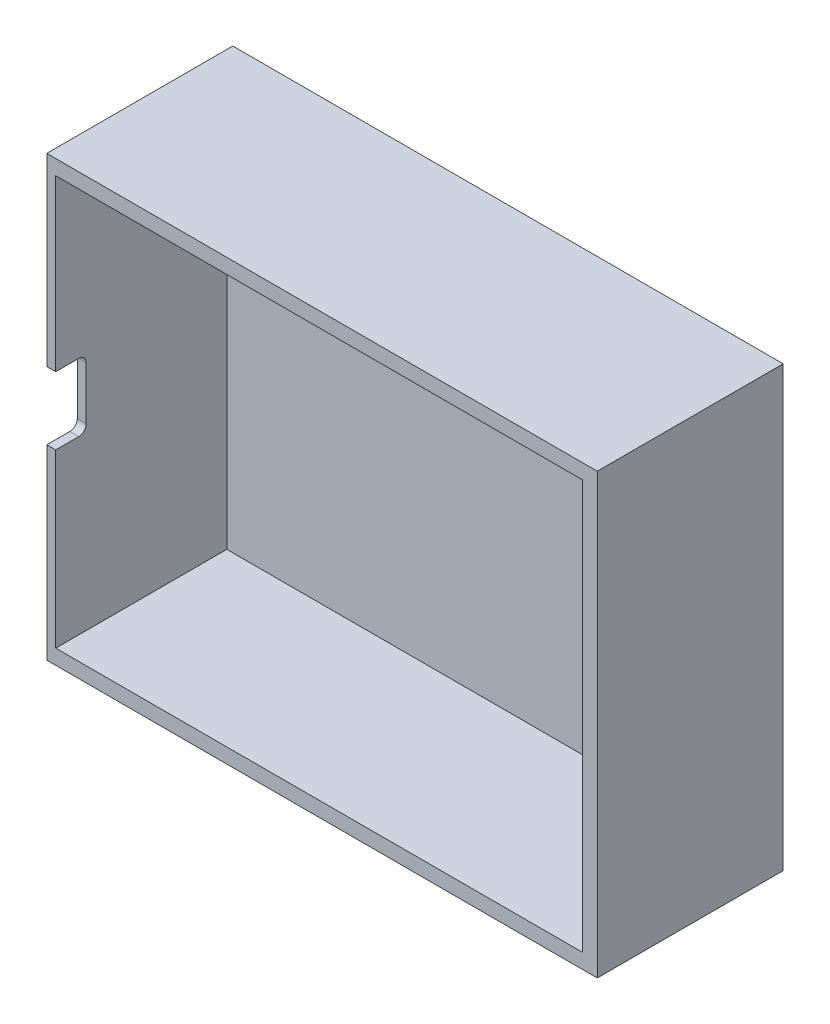
ISO-10303-21;
HEADER;
FILE_DESCRIPTION(('STEP AP214'),'2;1');
FILE_NAME('part.step','',(''),(''),'','','');
FILE_SCHEMA(('AUTOMOTIVE_DESIGN { 1 0 10303 214 1 1 1 1 }'));
ENDSEC;
DATA;
#1=APPLICATION_CONTEXT('core data for automotive mechanical design processes');
#2=APPLICATION_PROTOCOL_DEFINITION('international standard','automotive_design',2000,#1);
#3=PRODUCT_CONTEXT('',#1,'mechanical');
#4=PRODUCT('Part','Part','',(#3));
#5=PRODUCT_RELATED_PRODUCT_CATEGORY('part','',(#4));
#6=PRODUCT_DEFINITION_FORMATION('','',#4);
#7=PRODUCT_DEFINITION_CONTEXT('part definition',#1,'design');
#8=PRODUCT_DEFINITION('design','',#6,#7);
#9=PRODUCT_DEFINITION_SHAPE('','',#8);
#10=(LENGTH_UNIT() NAMED_UNIT(*) SI_UNIT(.MILLI.,.METRE.));
#11=(NAMED_UNIT(*) PLANE_ANGLE_UNIT() SI_UNIT($,.RADIAN.));
#12=(NAMED_UNIT(*) SI_UNIT($,.STERADIAN.) SOLID_ANGLE_UNIT());
#13=UNCERTAINTY_MEASURE_WITH_UNIT(LENGTH_MEASURE(1.E-05),#10,'distance_accuracy_value','');
#14=(GEOMETRIC_REPRESENTATION_CONTEXT(3) GLOBAL_UNCERTAINTY_ASSIGNED_CONTEXT((#13)) GLOBAL_UNIT_ASSIGNED_CONTEXT((#10,
#11,#12)) REPRESENTATION_CONTEXT('',''));
#15=CARTESIAN_POINT('',(0.,0.,0.));
#16=DIRECTION('',(0.,0.,1.));
#17=DIRECTION('',(1.,0.,0.));
#18=AXIS2_PLACEMENT_3D('',#15,#16,#17);
#19=CARTESIAN_POINT('',(590.712029930621,17.7517985611511,25.));
#20=DIRECTION('',(1.,0.,0.));
#21=DIRECTION('',(0.,0.,-1.));
#22=AXIS2_PLACEMENT_3D('',#19,#20,#21);
#23=PLANE('',#22);
#24=DIRECTION('',(0.,-1.,0.));
#25=VECTOR('',#24,1.);
#26=CARTESIAN_POINT('',(590.712029930621,17.7517985611511,25.));
#27=LINE('',#26,#25);
#28=CARTESIAN_POINT('',(590.712029930621,-16.1723211134984,25.));
#29=VERTEX_POINT('',#28);
#30=CARTESIAN_POINT('',(590.712029930621,-41.2482014388489,25.));
#31=VERTEX_POINT('',#30);
#32=EDGE_CURVE('E175',#29,#31,#27,.T.);
#33=ORIENTED_EDGE('',*,*,#32,.F.);
#34=DIRECTION('',(0.,0.,1.));
#35=VECTOR('',#34,1.);
#36=CARTESIAN_POINT('',(590.712029930621,-16.1723211134984,21.9));
#37=LINE('',#36,#35);
#38=CARTESIAN_POINT('',(590.712029930621,-16.1723211134984,21.9));
#39=VERTEX_POINT('',#38);
#40=EDGE_CURVE('E142',#39,#29,#37,.T.);
#41=ORIENTED_EDGE('',*,*,#40,.F.);
#42=CARTESIAN_POINT('',(590.712029930621,-15.1723211134984,21.9));
#43=DIRECTION('',(-1.,0.,0.));
#44=DIRECTION('',(0.,0.,1.));
#45=AXIS2_PLACEMENT_3D('',#42,#43,#44);
#46=CIRCLE('',#45,1.);
#47=CARTESIAN_POINT('',(590.712029930621,-15.1723211134984,20.9));
#48=VERTEX_POINT('',#47);
#49=EDGE_CURVE('E229',#48,#39,#46,.T.);
#50=ORIENTED_EDGE('',*,*,#49,.F.);
#51=DIRECTION('',(0.,-1.,0.));
#52=VECTOR('',#51,1.);
#53=CARTESIAN_POINT('',(590.712029930621,-8.07232111349837,20.9));
#54=LINE('',#53,#52);
#55=CARTESIAN_POINT('',(590.712029930621,-8.07232111349837,20.9));
#56=VERTEX_POINT('',#55);
#57=EDGE_CURVE('E222',#56,#48,#54,.T.);
#58=ORIENTED_EDGE('',*,*,#57,.F.);
#59=CARTESIAN_POINT('',(590.712029930621,-8.07232111349837,21.9));
#60=DIRECTION('',(-1.,0.,0.));
#61=DIRECTION('',(0.,0.,-1.));
#62=AXIS2_PLACEMENT_3D('',#59,#60,#61);
#63=CIRCLE('',#62,1.);
#64=CARTESIAN_POINT('',(590.712029930621,-7.07232111349837,21.9));
#65=VERTEX_POINT('',#64);
#66=EDGE_CURVE('E220',#65,#56,#63,.T.);
#67=ORIENTED_EDGE('',*,*,#66,.F.);
#68=DIRECTION('',(0.,0.,-1.));
#69=VECTOR('',#68,1.);
#70=CARTESIAN_POINT('',(590.712029930621,-7.07232111349838,21.9));
#71=LINE('',#70,#69);
#72=CARTESIAN_POINT('',(590.712029930621,-7.07232111349837,25.));
#73=VERTEX_POINT('',#72);
#74=EDGE_CURVE('E217',#73,#65,#71,.T.);
#75=ORIENTED_EDGE('',*,*,#74,.F.);
#76=CARTESIAN_POINT('',(590.712029930621,17.7517985611511,25.));
#77=VERTEX_POINT('',#76);
#78=EDGE_CURVE('E152',#77,#73,#27,.T.);
#79=ORIENTED_EDGE('',*,*,#78,.F.);
#80=DIRECTION('',(0.,0.,-1.));
#81=VECTOR('',#80,1.);
#82=CARTESIAN_POINT('',(590.712029930621,17.7517985611511,25.));
#83=LINE('',#82,#81);
#84=CARTESIAN_POINT('',(590.712029930621,17.7517985611511,0.));
#85=VERTEX_POINT('',#84);
#86=EDGE_CURVE('E181',#77,#85,#83,.T.);
#87=ORIENTED_EDGE('',*,*,#86,.T.);
#88=DIRECTION('',(0.,-1.,0.));
#89=VECTOR('',#88,1.);
#90=CARTESIAN_POINT('',(590.712029930621,17.7517985611511,0.));
#91=LINE('',#90,#89);
#92=CARTESIAN_POINT('',(590.712029930621,-41.2482014388489,0.));
#93=VERTEX_POINT('',#92);
#94=EDGE_CURVE('E182',#85,#93,#91,.T.);
#95=ORIENTED_EDGE('',*,*,#94,.T.);
#96=DIRECTION('',(0.,0.,-1.));
#97=VECTOR('',#96,1.);
#98=CARTESIAN_POINT('',(590.712029930621,-41.2482014388489,25.));
#99=LINE('',#98,#97);
#100=EDGE_CURVE('E11',#31,#93,#99,.T.);
#101=ORIENTED_EDGE('',*,*,#100,.F.);
#102=EDGE_LOOP('',(#33,#41,#50,#58,#67,#75,#79,#87,#95,#101));
#103=FACE_BOUND('',#102,.T.);
#104=ADVANCED_FACE('F33',(#103),#23,.F.);
#105=CARTESIAN_POINT('',(590.712029930621,-41.2482014388489,25.));
#106=DIRECTION('',(0.,1.,0.));
#107=DIRECTION('',(0.,0.,1.));
#108=AXIS2_PLACEMENT_3D('',#105,#106,#107);
#109=PLANE('',#108);
#110=DIRECTION('',(1.,0.,0.));
#111=VECTOR('',#110,1.);
#112=CARTESIAN_POINT('',(590.712029930621,-41.2482014388489,0.));
#113=LINE('',#112,#111);
#114=CARTESIAN_POINT('',(664.712029930621,-41.2482014388489,0.));
#115=VERTEX_POINT('',#114);
#116=EDGE_CURVE('E185',#93,#115,#113,.T.);
#117=ORIENTED_EDGE('',*,*,#116,.T.);
#118=DIRECTION('',(0.,0.,-1.));
#119=VECTOR('',#118,1.);
#120=CARTESIAN_POINT('',(664.712029930621,-41.2482014388489,25.));
#121=LINE('',#120,#119);
#122=CARTESIAN_POINT('',(664.712029930621,-41.2482014388489,25.));
#123=VERTEX_POINT('',#122);
#124=EDGE_CURVE('E40',#123,#115,#121,.T.);
#125=ORIENTED_EDGE('',*,*,#124,.F.);
#126=DIRECTION('',(1.,0.,0.));
#127=VECTOR('',#126,1.);
#128=CARTESIAN_POINT('',(590.712029930621,-41.2482014388489,25.));
#129=LINE('',#128,#127);
#130=EDGE_CURVE('E174',#31,#123,#129,.T.);
#131=ORIENTED_EDGE('',*,*,#130,.F.);
#132=ORIENTED_EDGE('',*,*,#100,.T.);
#133=EDGE_LOOP('',(#117,#125,#131,#132));
#134=FACE_BOUND('',#133,.T.);
#135=ADVANCED_FACE('F284',(#134),#109,.F.);
#136=CARTESIAN_POINT('',(664.712029930621,17.7517985611511,25.));
#137=DIRECTION('',(-1.,0.,0.));
#138=DIRECTION('',(0.,-1.,0.));
#139=AXIS2_PLACEMENT_3D('',#136,#137,#138);
#140=PLANE('',#139);
#141=DIRECTION('',(0.,1.,0.));
#142=VECTOR('',#141,1.);
#143=CARTESIAN_POINT('',(664.712029930621,17.7517985611511,0.));
#144=LINE('',#143,#142);
#145=CARTESIAN_POINT('',(664.712029930621,17.7517985611511,0.));
#146=VERTEX_POINT('',#145);
#147=EDGE_CURVE('E188',#115,#146,#144,.T.);
#148=ORIENTED_EDGE('',*,*,#147,.T.);
#149=DIRECTION('',(0.,0.,-1.));
#150=VECTOR('',#149,1.);
#151=CARTESIAN_POINT('',(664.712029930621,17.7517985611511,25.));
#152=LINE('',#151,#150);
#153=CARTESIAN_POINT('',(664.712029930621,17.7517985611511,25.));
#154=VERTEX_POINT('',#153);
#155=EDGE_CURVE('E194',#154,#146,#152,.T.);
#156=ORIENTED_EDGE('',*,*,#155,.F.);
#157=DIRECTION('',(0.,1.,0.));
#158=VECTOR('',#157,1.);
#159=CARTESIAN_POINT('',(664.712029930621,17.7517985611511,25.));
#160=LINE('',#159,#158);
#161=EDGE_CURVE('E177',#123,#154,#160,.T.);
#162=ORIENTED_EDGE('',*,*,#161,.F.);
#163=ORIENTED_EDGE('',*,*,#124,.T.);
#164=EDGE_LOOP('',(#148,#156,#162,#163));
#165=FACE_BOUND('',#164,.T.);
#166=ADVANCED_FACE('F201',(#165),#140,.F.);
#167=CARTESIAN_POINT('',(590.712029930621,17.7517985611511,25.));
#168=DIRECTION('',(0.,-1.,0.));
#169=DIRECTION('',(0.,0.,-1.));
#170=AXIS2_PLACEMENT_3D('',#167,#168,#169);
#171=PLANE('',#170);
#172=DIRECTION('',(-1.,0.,0.));
#173=VECTOR('',#172,1.);
#174=CARTESIAN_POINT('',(590.712029930621,17.7517985611511,0.));
#175=LINE('',#174,#173);
#176=EDGE_CURVE('E190',#146,#85,#175,.T.);
#177=ORIENTED_EDGE('',*,*,#176,.T.);
#178=ORIENTED_EDGE('',*,*,#86,.F.);
#179=DIRECTION('',(-1.,0.,0.));
#180=VECTOR('',#179,1.);
#181=CARTESIAN_POINT('',(590.712029930621,17.7517985611511,25.));
#182=LINE('',#181,#180);
#183=EDGE_CURVE('E179',#154,#77,#182,.T.);
#184=ORIENTED_EDGE('',*,*,#183,.F.);
#185=ORIENTED_EDGE('',*,*,#155,.T.);
#186=EDGE_LOOP('',(#177,#178,#184,#185));
#187=FACE_BOUND('',#186,.T.);
#188=ADVANCED_FACE('F211',(#187),#171,.F.);
#189=CARTESIAN_POINT('',(0.,0.,25.));
#190=DIRECTION('',(0.,0.,1.));
#191=DIRECTION('',(1.,0.,0.));
#192=AXIS2_PLACEMENT_3D('',#189,#190,#191);
#193=PLANE('',#192);
#194=DIRECTION('',(-1.,0.,0.));
#195=VECTOR('',#194,1.);
#196=CARTESIAN_POINT('',(591.912029930621,-16.1723211134984,25.));
#197=LINE('',#196,#195);
#198=CARTESIAN_POINT('',(591.912029930621,-16.1723211134984,25.));
#199=VERTEX_POINT('',#198);
#200=EDGE_CURVE('E233',#199,#29,#197,.T.);
#201=ORIENTED_EDGE('',*,*,#200,.T.);
#202=ORIENTED_EDGE('',*,*,#32,.T.);
#203=ORIENTED_EDGE('',*,*,#130,.T.);
#204=ORIENTED_EDGE('',*,*,#161,.T.);
#205=ORIENTED_EDGE('',*,*,#183,.T.);
#206=ORIENTED_EDGE('',*,*,#78,.T.);
#207=DIRECTION('',(-1.,0.,0.));
#208=VECTOR('',#207,1.);
#209=CARTESIAN_POINT('',(591.912029930621,-7.07232111349837,25.));
#210=LINE('',#209,#208);
#211=CARTESIAN_POINT('',(591.912029930621,-7.07232111349837,25.));
#212=VERTEX_POINT('',#211);
#213=EDGE_CURVE('E137',#212,#73,#210,.T.);
#214=ORIENTED_EDGE('',*,*,#213,.F.);
#215=DIRECTION('',(0.,-1.,0.));
#216=VECTOR('',#215,1.);
#217=CARTESIAN_POINT('',(591.912029930621,17.7517985611511,25.));
#218=LINE('',#217,#216);
#219=CARTESIAN_POINT('',(591.912029930621,15.7517985611511,25.));
#220=VERTEX_POINT('',#219);
#221=EDGE_CURVE('E150',#220,#212,#218,.T.);
#222=ORIENTED_EDGE('',*,*,#221,.F.);
#223=DIRECTION('',(-1.,0.,0.));
#224=VECTOR('',#223,1.);
#225=CARTESIAN_POINT('',(590.712029930621,15.7517985611511,25.));
#226=LINE('',#225,#224);
#227=CARTESIAN_POINT('',(662.712029930621,15.7517985611511,25.));
#228=VERTEX_POINT('',#227);
#229=EDGE_CURVE('E171',#228,#220,#226,.T.);
#230=ORIENTED_EDGE('',*,*,#229,.F.);
#231=DIRECTION('',(0.,1.,0.));
#232=VECTOR('',#231,1.);
#233=CARTESIAN_POINT('',(662.712029930621,17.7517985611511,25.));
#234=LINE('',#233,#232);
#235=CARTESIAN_POINT('',(662.712029930621,-39.2482014388489,25.));
#236=VERTEX_POINT('',#235);
#237=EDGE_CURVE('E164',#236,#228,#234,.T.);
#238=ORIENTED_EDGE('',*,*,#237,.F.);
#239=DIRECTION('',(1.,0.,0.));
#240=VECTOR('',#239,1.);
#241=CARTESIAN_POINT('',(590.712029930621,-39.2482014388489,25.));
#242=LINE('',#241,#240);
#243=CARTESIAN_POINT('',(591.912029930621,-39.2482014388489,25.));
#244=VERTEX_POINT('',#243);
#245=EDGE_CURVE('E161',#244,#236,#242,.T.);
#246=ORIENTED_EDGE('',*,*,#245,.F.);
#247=EDGE_CURVE('E162',#199,#244,#218,.T.);
#248=ORIENTED_EDGE('',*,*,#247,.F.);
#249=EDGE_LOOP('',(#201,#202,#203,#204,#205,#206,#214,#222,#230,#238,#246,#248));
#250=FACE_BOUND('',#249,.T.);
#251=ADVANCED_FACE('F148',(#250),#193,.T.);
#252=CARTESIAN_POINT('',(0.,0.,0.));
#253=DIRECTION('',(0.,0.,1.));
#254=DIRECTION('',(1.,0.,0.));
#255=AXIS2_PLACEMENT_3D('',#252,#253,#254);
#256=PLANE('',#255);
#257=ORIENTED_EDGE('',*,*,#94,.F.);
#258=ORIENTED_EDGE('',*,*,#176,.F.);
#259=ORIENTED_EDGE('',*,*,#147,.F.);
#260=ORIENTED_EDGE('',*,*,#116,.F.);
#261=EDGE_LOOP('',(#257,#258,#259,#260));
#262=FACE_BOUND('',#261,.T.);
#263=ADVANCED_FACE('F208',(#262),#256,.F.);
#264=CARTESIAN_POINT('',(591.912029930621,17.7517985611511,25.));
#265=DIRECTION('',(1.,0.,0.));
#266=DIRECTION('',(0.,0.,-1.));
#267=AXIS2_PLACEMENT_3D('',#264,#265,#266);
#268=PLANE('',#267);
#269=DIRECTION('',(0.,0.,1.));
#270=VECTOR('',#269,1.);
#271=CARTESIAN_POINT('',(591.912029930621,-16.1723211134984,21.9));
#272=LINE('',#271,#270);
#273=CARTESIAN_POINT('',(591.912029930621,-16.1723211134984,21.9));
#274=VERTEX_POINT('',#273);
#275=EDGE_CURVE('E153',#274,#199,#272,.T.);
#276=ORIENTED_EDGE('',*,*,#275,.T.);
#277=ORIENTED_EDGE('',*,*,#247,.T.);
#278=DIRECTION('',(0.,0.,-1.));
#279=VECTOR('',#278,1.);
#280=CARTESIAN_POINT('',(591.912029930621,-39.2482014388489,25.));
#281=LINE('',#280,#279);
#282=CARTESIAN_POINT('',(591.912029930621,-39.2482014388489,2.));
#283=VERTEX_POINT('',#282);
#284=EDGE_CURVE('E186',#244,#283,#281,.T.);
#285=ORIENTED_EDGE('',*,*,#284,.T.);
#286=DIRECTION('',(0.,-1.,0.));
#287=VECTOR('',#286,1.);
#288=CARTESIAN_POINT('',(591.912029930621,17.7517985611511,2.));
#289=LINE('',#288,#287);
#290=CARTESIAN_POINT('',(591.912029930621,15.7517985611511,2.));
#291=VERTEX_POINT('',#290);
#292=EDGE_CURVE('E235',#291,#283,#289,.T.);
#293=ORIENTED_EDGE('',*,*,#292,.F.);
#294=DIRECTION('',(0.,0.,-1.));
#295=VECTOR('',#294,1.);
#296=CARTESIAN_POINT('',(591.912029930621,15.7517985611511,25.));
#297=LINE('',#296,#295);
#298=EDGE_CURVE('E160',#220,#291,#297,.T.);
#299=ORIENTED_EDGE('',*,*,#298,.F.);
#300=ORIENTED_EDGE('',*,*,#221,.T.);
#301=DIRECTION('',(0.,0.,-1.));
#302=VECTOR('',#301,1.);
#303=CARTESIAN_POINT('',(591.912029930621,-7.07232111349838,21.9));
#304=LINE('',#303,#302);
#305=CARTESIAN_POINT('',(591.912029930621,-7.07232111349838,21.9));
#306=VERTEX_POINT('',#305);
#307=EDGE_CURVE('E133',#212,#306,#304,.T.);
#308=ORIENTED_EDGE('',*,*,#307,.T.);
#309=CARTESIAN_POINT('',(591.912029930621,-8.07232111349837,21.9));
#310=DIRECTION('',(-1.,0.,0.));
#311=DIRECTION('',(0.,0.,-1.));
#312=AXIS2_PLACEMENT_3D('',#309,#310,#311);
#313=CIRCLE('',#312,1.);
#314=CARTESIAN_POINT('',(591.912029930621,-8.07232111349837,20.9));
#315=VERTEX_POINT('',#314);
#316=EDGE_CURVE('E47',#306,#315,#313,.T.);
#317=ORIENTED_EDGE('',*,*,#316,.T.);
#318=DIRECTION('',(0.,-1.,0.));
#319=VECTOR('',#318,1.);
#320=CARTESIAN_POINT('',(591.912029930621,-8.07232111349837,20.9));
#321=LINE('',#320,#319);
#322=CARTESIAN_POINT('',(591.912029930621,-15.1723211134984,20.9));
#323=VERTEX_POINT('',#322);
#324=EDGE_CURVE('E273',#315,#323,#321,.T.);
#325=ORIENTED_EDGE('',*,*,#324,.T.);
#326=CARTESIAN_POINT('',(591.912029930621,-15.1723211134984,21.9));
#327=DIRECTION('',(-1.,0.,0.));
#328=DIRECTION('',(0.,0.,1.));
#329=AXIS2_PLACEMENT_3D('',#326,#327,#328);
#330=CIRCLE('',#329,1.);
#331=EDGE_CURVE('E271',#323,#274,#330,.T.);
#332=ORIENTED_EDGE('',*,*,#331,.T.);
#333=EDGE_LOOP('',(#276,#277,#285,#293,#299,#300,#308,#317,#325,#332));
#334=FACE_BOUND('',#333,.T.);
#335=ADVANCED_FACE('F157',(#334),#268,.T.);
#336=CARTESIAN_POINT('',(590.712029930621,-39.2482014388489,25.));
#337=DIRECTION('',(0.,1.,0.));
#338=DIRECTION('',(0.,0.,1.));
#339=AXIS2_PLACEMENT_3D('',#336,#337,#338);
#340=PLANE('',#339);
#341=DIRECTION('',(1.,0.,0.));
#342=VECTOR('',#341,1.);
#343=CARTESIAN_POINT('',(590.712029930621,-39.2482014388489,2.));
#344=LINE('',#343,#342);
#345=CARTESIAN_POINT('',(662.712029930621,-39.2482014388489,2.));
#346=VERTEX_POINT('',#345);
#347=EDGE_CURVE('E245',#283,#346,#344,.T.);
#348=ORIENTED_EDGE('',*,*,#347,.F.);
#349=ORIENTED_EDGE('',*,*,#284,.F.);
#350=ORIENTED_EDGE('',*,*,#245,.T.);
#351=DIRECTION('',(0.,0.,-1.));
#352=VECTOR('',#351,1.);
#353=CARTESIAN_POINT('',(662.712029930621,-39.2482014388489,25.));
#354=LINE('',#353,#352);
#355=EDGE_CURVE('E248',#236,#346,#354,.T.);
#356=ORIENTED_EDGE('',*,*,#355,.T.);
#357=EDGE_LOOP('',(#348,#349,#350,#356));
#358=FACE_BOUND('',#357,.T.);
#359=ADVANCED_FACE('F264',(#358),#340,.T.);
#360=CARTESIAN_POINT('',(662.712029930621,17.7517985611511,25.));
#361=DIRECTION('',(-1.,0.,0.));
#362=DIRECTION('',(0.,-1.,0.));
#363=AXIS2_PLACEMENT_3D('',#360,#361,#362);
#364=PLANE('',#363);
#365=DIRECTION('',(0.,1.,0.));
#366=VECTOR('',#365,1.);
#367=CARTESIAN_POINT('',(662.712029930621,17.7517985611511,2.));
#368=LINE('',#367,#366);
#369=CARTESIAN_POINT('',(662.712029930621,15.7517985611511,2.));
#370=VERTEX_POINT('',#369);
#371=EDGE_CURVE('E251',#346,#370,#368,.T.);
#372=ORIENTED_EDGE('',*,*,#371,.F.);
#373=ORIENTED_EDGE('',*,*,#355,.F.);
#374=ORIENTED_EDGE('',*,*,#237,.T.);
#375=DIRECTION('',(0.,0.,-1.));
#376=VECTOR('',#375,1.);
#377=CARTESIAN_POINT('',(662.712029930621,15.7517985611511,25.));
#378=LINE('',#377,#376);
#379=EDGE_CURVE('E55',#228,#370,#378,.T.);
#380=ORIENTED_EDGE('',*,*,#379,.T.);
#381=EDGE_LOOP('',(#372,#373,#374,#380));
#382=FACE_BOUND('',#381,.T.);
#383=ADVANCED_FACE('F256',(#382),#364,.T.);
#384=CARTESIAN_POINT('',(590.712029930621,15.7517985611511,25.));
#385=DIRECTION('',(0.,-1.,0.));
#386=DIRECTION('',(0.,0.,-1.));
#387=AXIS2_PLACEMENT_3D('',#384,#385,#386);
#388=PLANE('',#387);
#389=DIRECTION('',(-1.,0.,0.));
#390=VECTOR('',#389,1.);
#391=CARTESIAN_POINT('',(590.712029930621,15.7517985611511,2.));
#392=LINE('',#391,#390);
#393=EDGE_CURVE('E166',#370,#291,#392,.T.);
#394=ORIENTED_EDGE('',*,*,#393,.F.);
#395=ORIENTED_EDGE('',*,*,#379,.F.);
#396=ORIENTED_EDGE('',*,*,#229,.T.);
#397=ORIENTED_EDGE('',*,*,#298,.T.);
#398=EDGE_LOOP('',(#394,#395,#396,#397));
#399=FACE_BOUND('',#398,.T.);
#400=ADVANCED_FACE('F259',(#399),#388,.T.);
#401=CARTESIAN_POINT('',(0.,0.,2.));
#402=DIRECTION('',(0.,0.,1.));
#403=DIRECTION('',(1.,0.,0.));
#404=AXIS2_PLACEMENT_3D('',#401,#402,#403);
#405=PLANE('',#404);
#406=ORIENTED_EDGE('',*,*,#292,.T.);
#407=ORIENTED_EDGE('',*,*,#347,.T.);
#408=ORIENTED_EDGE('',*,*,#371,.T.);
#409=ORIENTED_EDGE('',*,*,#393,.T.);
#410=EDGE_LOOP('',(#406,#407,#408,#409));
#411=FACE_BOUND('',#410,.T.);
#412=ADVANCED_FACE('F261',(#411),#405,.T.);
#413=CARTESIAN_POINT('',(591.912029930621,-16.1723211134984,21.9));
#414=DIRECTION('',(0.,-1.,0.));
#415=DIRECTION('',(0.,0.,-1.));
#416=AXIS2_PLACEMENT_3D('',#413,#414,#415);
#417=PLANE('',#416);
#418=ORIENTED_EDGE('',*,*,#40,.T.);
#419=ORIENTED_EDGE('',*,*,#200,.F.);
#420=ORIENTED_EDGE('',*,*,#275,.F.);
#421=DIRECTION('',(-1.,0.,0.));
#422=VECTOR('',#421,1.);
#423=CARTESIAN_POINT('',(591.912029930621,-16.1723211134984,21.9));
#424=LINE('',#423,#422);
#425=EDGE_CURVE('E236',#274,#39,#424,.T.);
#426=ORIENTED_EDGE('',*,*,#425,.T.);
#427=EDGE_LOOP('',(#418,#419,#420,#426));
#428=FACE_BOUND('',#427,.T.);
#429=ADVANCED_FACE('F283',(#428),#417,.F.);
#430=CARTESIAN_POINT('',(591.912029930621,-15.1723211134984,21.9));
#431=DIRECTION('',(-1.,0.,0.));
#432=DIRECTION('',(0.,0.,1.));
#433=AXIS2_PLACEMENT_3D('',#430,#431,#432);
#434=CYLINDRICAL_SURFACE('',#433,1.);
#435=ORIENTED_EDGE('',*,*,#49,.T.);
#436=ORIENTED_EDGE('',*,*,#425,.F.);
#437=ORIENTED_EDGE('',*,*,#331,.F.);
#438=DIRECTION('',(-1.,0.,0.));
#439=VECTOR('',#438,1.);
#440=CARTESIAN_POINT('',(591.912029930621,-15.1723211134984,20.9));
#441=LINE('',#440,#439);
#442=EDGE_CURVE('E238',#323,#48,#441,.T.);
#443=ORIENTED_EDGE('',*,*,#442,.T.);
#444=EDGE_LOOP('',(#435,#436,#437,#443));
#445=FACE_BOUND('',#444,.T.);
#446=ADVANCED_FACE('F281',(#445),#434,.F.);
#447=CARTESIAN_POINT('',(591.912029930621,-8.07232111349837,20.9));
#448=DIRECTION('',(0.,0.,-1.));
#449=DIRECTION('',(-1.,0.,0.));
#450=AXIS2_PLACEMENT_3D('',#447,#448,#449);
#451=PLANE('',#450);
#452=ORIENTED_EDGE('',*,*,#57,.T.);
#453=ORIENTED_EDGE('',*,*,#442,.F.);
#454=ORIENTED_EDGE('',*,*,#324,.F.);
#455=DIRECTION('',(-1.,0.,0.));
#456=VECTOR('',#455,1.);
#457=CARTESIAN_POINT('',(591.912029930621,-8.07232111349837,20.9));
#458=LINE('',#457,#456);
#459=EDGE_CURVE('E240',#315,#56,#458,.T.);
#460=ORIENTED_EDGE('',*,*,#459,.T.);
#461=EDGE_LOOP('',(#452,#453,#454,#460));
#462=FACE_BOUND('',#461,.T.);
#463=ADVANCED_FACE('F278',(#462),#451,.F.);
#464=CARTESIAN_POINT('',(591.912029930621,-8.07232111349837,21.9));
#465=DIRECTION('',(-1.,0.,0.));
#466=DIRECTION('',(0.,0.,1.));
#467=AXIS2_PLACEMENT_3D('',#464,#465,#466);
#468=CYLINDRICAL_SURFACE('',#467,1.);
#469=ORIENTED_EDGE('',*,*,#66,.T.);
#470=ORIENTED_EDGE('',*,*,#459,.F.);
#471=ORIENTED_EDGE('',*,*,#316,.F.);
#472=DIRECTION('',(-1.,0.,0.));
#473=VECTOR('',#472,1.);
#474=CARTESIAN_POINT('',(591.912029930621,-7.07232111349837,21.9));
#475=LINE('',#474,#473);
#476=EDGE_CURVE('E139',#306,#65,#475,.T.);
#477=ORIENTED_EDGE('',*,*,#476,.T.);
#478=EDGE_LOOP('',(#469,#470,#471,#477));
#479=FACE_BOUND('',#478,.T.);
#480=ADVANCED_FACE('F311',(#479),#468,.F.);
#481=CARTESIAN_POINT('',(591.912029930621,-7.07232111349838,21.9));
#482=DIRECTION('',(0.,1.,0.));
#483=DIRECTION('',(0.,0.,1.));
#484=AXIS2_PLACEMENT_3D('',#481,#482,#483);
#485=PLANE('',#484);
#486=ORIENTED_EDGE('',*,*,#74,.T.);
#487=ORIENTED_EDGE('',*,*,#476,.F.);
#488=ORIENTED_EDGE('',*,*,#307,.F.);
#489=ORIENTED_EDGE('',*,*,#213,.T.);
#490=EDGE_LOOP('',(#486,#487,#488,#489));
#491=FACE_BOUND('',#490,.T.);
#492=ADVANCED_FACE('F136',(#491),#485,.F.);
#493=CLOSED_SHELL('',(#104,#135,#166,#188,#251,#263,#335,#359,#383,#400,#412,#429,#446,#463,
#480,#492));
#494=MANIFOLD_SOLID_BREP('B2',#493);
#495=ADVANCED_BREP_SHAPE_REPRESENTATION('',(#18,#494),#14);
#496=SHAPE_DEFINITION_REPRESENTATION(#9,#495);
ENDSEC;
END-ISO-10303-21;
